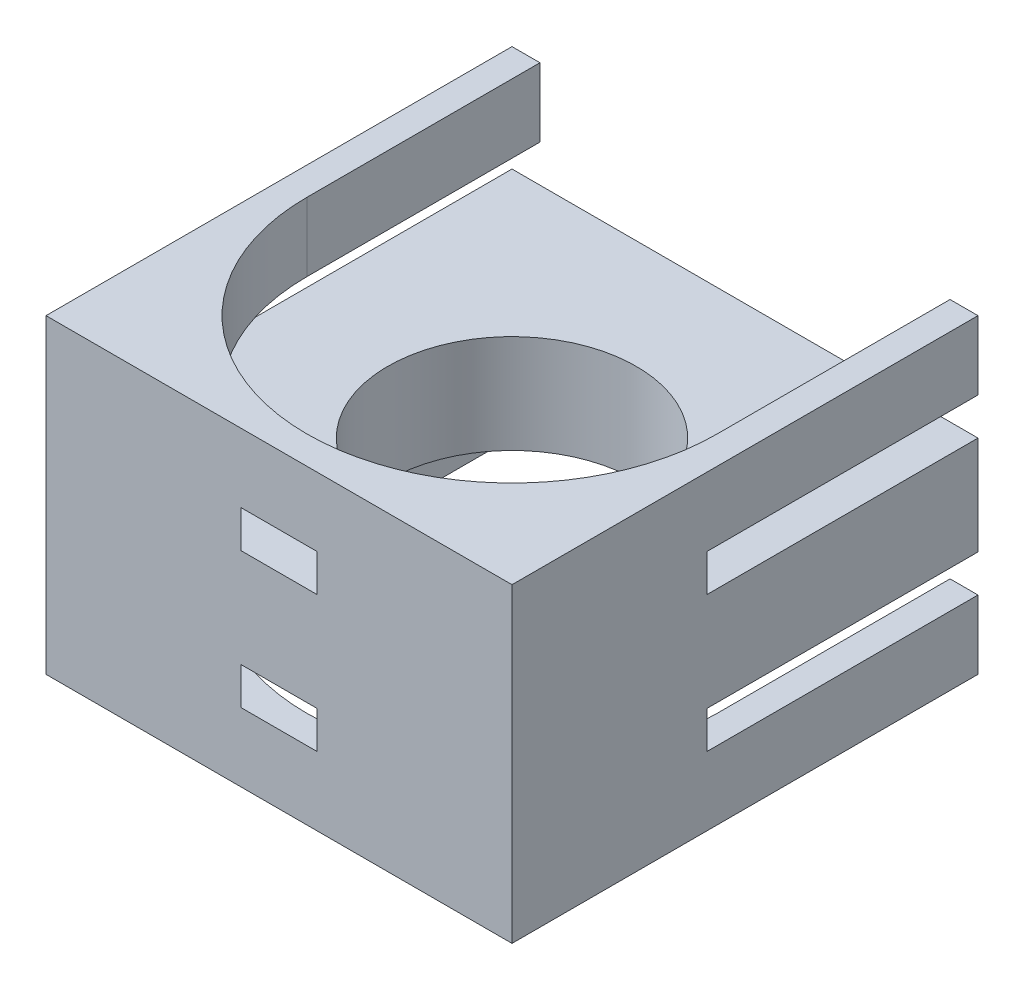
ISO-10303-21;
HEADER;
FILE_DESCRIPTION(('STEP AP214'),'2;1');
FILE_NAME('part.step','',(''),(''),'','','');
FILE_SCHEMA(('AUTOMOTIVE_DESIGN { 1 0 10303 214 1 1 1 1 }'));
ENDSEC;
DATA;
#1=APPLICATION_CONTEXT('core data for automotive mechanical design processes');
#2=APPLICATION_PROTOCOL_DEFINITION('international standard','automotive_design',2000,#1);
#3=PRODUCT_CONTEXT('',#1,'mechanical');
#4=PRODUCT('Part','Part','',(#3));
#5=PRODUCT_RELATED_PRODUCT_CATEGORY('part','',(#4));
#6=PRODUCT_DEFINITION_FORMATION('','',#4);
#7=PRODUCT_DEFINITION_CONTEXT('part definition',#1,'design');
#8=PRODUCT_DEFINITION('design','',#6,#7);
#9=PRODUCT_DEFINITION_SHAPE('','',#8);
#10=(LENGTH_UNIT() NAMED_UNIT(*) SI_UNIT(.MILLI.,.METRE.));
#11=(NAMED_UNIT(*) PLANE_ANGLE_UNIT() SI_UNIT($,.RADIAN.));
#12=(NAMED_UNIT(*) SI_UNIT($,.STERADIAN.) SOLID_ANGLE_UNIT());
#13=UNCERTAINTY_MEASURE_WITH_UNIT(LENGTH_MEASURE(1.E-05),#10,'distance_accuracy_value','');
#14=(GEOMETRIC_REPRESENTATION_CONTEXT(3) GLOBAL_UNCERTAINTY_ASSIGNED_CONTEXT((#13)) GLOBAL_UNIT_ASSIGNED_CONTEXT((#10,
#11,#12)) REPRESENTATION_CONTEXT('',''));
#15=CARTESIAN_POINT('',(0.,0.,0.));
#16=DIRECTION('',(0.,0.,1.));
#17=DIRECTION('',(1.,0.,0.));
#18=AXIS2_PLACEMENT_3D('',#15,#16,#17);
#19=CARTESIAN_POINT('',(0.,5.,15.));
#20=DIRECTION('',(1.,0.,0.));
#21=DIRECTION('',(0.,0.,-1.));
#22=AXIS2_PLACEMENT_3D('',#19,#20,#21);
#23=PLANE('',#22);
#24=DIRECTION('',(0.,0.,1.));
#25=VECTOR('',#24,1.);
#26=CARTESIAN_POINT('',(0.,0.912499999999999,15.));
#27=LINE('',#26,#25);
#28=CARTESIAN_POINT('',(0.,0.912499999999999,0.));
#29=VERTEX_POINT('',#28);
#30=CARTESIAN_POINT('',(0.,0.912499999999999,8.72882057274446));
#31=VERTEX_POINT('',#30);
#32=EDGE_CURVE('E244',#29,#31,#27,.T.);
#33=ORIENTED_EDGE('',*,*,#32,.T.);
#34=DIRECTION('',(0.,1.,0.));
#35=VECTOR('',#34,1.);
#36=CARTESIAN_POINT('',(0.,-21.7835461480711,8.72882057274446));
#37=LINE('',#36,#35);
#38=CARTESIAN_POINT('',(0.,-0.287500000000003,8.72882057274447));
#39=VERTEX_POINT('',#38);
#40=EDGE_CURVE('E390',#39,#31,#37,.T.);
#41=ORIENTED_EDGE('',*,*,#40,.F.);
#42=DIRECTION('',(0.,0.,-1.));
#43=VECTOR('',#42,1.);
#44=CARTESIAN_POINT('',(0.,-0.287500000000004,15.));
#45=LINE('',#44,#43);
#46=CARTESIAN_POINT('',(0.,-0.287500000000004,0.));
#47=VERTEX_POINT('',#46);
#48=EDGE_CURVE('E251',#39,#47,#45,.T.);
#49=ORIENTED_EDGE('',*,*,#48,.T.);
#50=DIRECTION('',(0.,-1.,0.));
#51=VECTOR('',#50,1.);
#52=CARTESIAN_POINT('',(0.,5.,0.));
#53=LINE('',#52,#51);
#54=CARTESIAN_POINT('',(0.,-2.5,0.));
#55=VERTEX_POINT('',#54);
#56=EDGE_CURVE('E258',#47,#55,#53,.T.);
#57=ORIENTED_EDGE('',*,*,#56,.T.);
#58=DIRECTION('',(0.,0.,1.));
#59=VECTOR('',#58,1.);
#60=CARTESIAN_POINT('',(0.,-2.5,-15.2069063257455));
#61=LINE('',#60,#59);
#62=CARTESIAN_POINT('',(0.,-2.5,15.));
#63=VERTEX_POINT('',#62);
#64=EDGE_CURVE('E303',#55,#63,#61,.T.);
#65=ORIENTED_EDGE('',*,*,#64,.T.);
#66=DIRECTION('',(0.,-1.,0.));
#67=VECTOR('',#66,1.);
#68=CARTESIAN_POINT('',(0.,5.,15.));
#69=LINE('',#68,#67);
#70=CARTESIAN_POINT('',(0.,7.5,15.));
#71=VERTEX_POINT('',#70);
#72=EDGE_CURVE('E272',#71,#63,#69,.T.);
#73=ORIENTED_EDGE('',*,*,#72,.F.);
#74=DIRECTION('',(0.,0.,1.));
#75=VECTOR('',#74,1.);
#76=CARTESIAN_POINT('',(0.,7.5,-15.2069063257455));
#77=LINE('',#76,#75);
#78=CARTESIAN_POINT('',(0.,7.5,0.));
#79=VERTEX_POINT('',#78);
#80=EDGE_CURVE('E314',#79,#71,#77,.T.);
#81=ORIENTED_EDGE('',*,*,#80,.F.);
#82=CARTESIAN_POINT('',(0.,5.2875,0.));
#83=VERTEX_POINT('',#82);
#84=EDGE_CURVE('E257',#79,#83,#53,.T.);
#85=ORIENTED_EDGE('',*,*,#84,.T.);
#86=DIRECTION('',(0.,0.,-1.));
#87=VECTOR('',#86,1.);
#88=CARTESIAN_POINT('',(0.,5.2875,15.));
#89=LINE('',#88,#87);
#90=CARTESIAN_POINT('',(0.,5.2875,8.72882057274447));
#91=VERTEX_POINT('',#90);
#92=EDGE_CURVE('E337',#91,#83,#89,.T.);
#93=ORIENTED_EDGE('',*,*,#92,.F.);
#94=DIRECTION('',(0.,-1.,0.));
#95=VECTOR('',#94,1.);
#96=CARTESIAN_POINT('',(0.,26.7835461480711,8.72882057274446));
#97=LINE('',#96,#95);
#98=CARTESIAN_POINT('',(0.,4.0875,8.72882057274446));
#99=VERTEX_POINT('',#98);
#100=EDGE_CURVE('E353',#99,#91,#97,.F.);
#101=ORIENTED_EDGE('',*,*,#100,.F.);
#102=DIRECTION('',(0.,0.,1.));
#103=VECTOR('',#102,1.);
#104=CARTESIAN_POINT('',(0.,4.0875,15.));
#105=LINE('',#104,#103);
#106=CARTESIAN_POINT('',(0.,4.0875,0.));
#107=VERTEX_POINT('',#106);
#108=EDGE_CURVE('E256',#107,#99,#105,.T.);
#109=ORIENTED_EDGE('',*,*,#108,.F.);
#110=EDGE_CURVE('E239',#107,#29,#53,.T.);
#111=ORIENTED_EDGE('',*,*,#110,.T.);
#112=EDGE_LOOP('',(#33,#41,#49,#57,#65,#73,#81,#85,#93,#101,#109,#111));
#113=FACE_BOUND('',#112,.T.);
#114=ADVANCED_FACE('F34',(#113),#23,.F.);
#115=CARTESIAN_POINT('',(15.,5.,15.));
#116=DIRECTION('',(-1.,0.,0.));
#117=DIRECTION('',(0.,0.,1.));
#118=AXIS2_PLACEMENT_3D('',#115,#116,#117);
#119=PLANE('',#118);
#120=DIRECTION('',(0.,1.,0.));
#121=VECTOR('',#120,1.);
#122=CARTESIAN_POINT('',(15.,-21.7835461480711,8.72882057274447));
#123=LINE('',#122,#121);
#124=CARTESIAN_POINT('',(15.,0.912499999999999,8.72882057274447));
#125=VERTEX_POINT('',#124);
#126=CARTESIAN_POINT('',(15.,-0.287500000000003,8.72882057274448));
#127=VERTEX_POINT('',#126);
#128=EDGE_CURVE('E392',#125,#127,#123,.F.);
#129=ORIENTED_EDGE('',*,*,#128,.F.);
#130=DIRECTION('',(0.,0.,-1.));
#131=VECTOR('',#130,1.);
#132=CARTESIAN_POINT('',(15.,0.912499999999999,15.));
#133=LINE('',#132,#131);
#134=CARTESIAN_POINT('',(15.,0.912499999999999,0.));
#135=VERTEX_POINT('',#134);
#136=EDGE_CURVE('E252',#125,#135,#133,.T.);
#137=ORIENTED_EDGE('',*,*,#136,.T.);
#138=DIRECTION('',(0.,-1.,0.));
#139=VECTOR('',#138,1.);
#140=CARTESIAN_POINT('',(15.,5.,0.));
#141=LINE('',#140,#139);
#142=CARTESIAN_POINT('',(15.,4.0875,0.));
#143=VERTEX_POINT('',#142);
#144=EDGE_CURVE('E241',#143,#135,#141,.T.);
#145=ORIENTED_EDGE('',*,*,#144,.F.);
#146=DIRECTION('',(0.,0.,-1.));
#147=VECTOR('',#146,1.);
#148=CARTESIAN_POINT('',(15.,4.0875,15.));
#149=LINE('',#148,#147);
#150=CARTESIAN_POINT('',(15.,4.0875,8.72882057274447));
#151=VERTEX_POINT('',#150);
#152=EDGE_CURVE('E286',#151,#143,#149,.T.);
#153=ORIENTED_EDGE('',*,*,#152,.F.);
#154=DIRECTION('',(0.,-1.,0.));
#155=VECTOR('',#154,1.);
#156=CARTESIAN_POINT('',(15.,26.7835461480711,8.72882057274447));
#157=LINE('',#156,#155);
#158=CARTESIAN_POINT('',(15.,5.2875,8.72882057274448));
#159=VERTEX_POINT('',#158);
#160=EDGE_CURVE('E356',#159,#151,#157,.T.);
#161=ORIENTED_EDGE('',*,*,#160,.F.);
#162=DIRECTION('',(0.,0.,1.));
#163=VECTOR('',#162,1.);
#164=CARTESIAN_POINT('',(15.,5.2875,15.));
#165=LINE('',#164,#163);
#166=CARTESIAN_POINT('',(15.,5.2875,0.));
#167=VERTEX_POINT('',#166);
#168=EDGE_CURVE('E331',#167,#159,#165,.T.);
#169=ORIENTED_EDGE('',*,*,#168,.F.);
#170=CARTESIAN_POINT('',(15.,7.5,0.));
#171=VERTEX_POINT('',#170);
#172=EDGE_CURVE('E267',#171,#167,#141,.T.);
#173=ORIENTED_EDGE('',*,*,#172,.F.);
#174=DIRECTION('',(0.,0.,1.));
#175=VECTOR('',#174,1.);
#176=CARTESIAN_POINT('',(15.,7.5,-15.2069063257455));
#177=LINE('',#176,#175);
#178=CARTESIAN_POINT('',(15.,7.5,15.));
#179=VERTEX_POINT('',#178);
#180=EDGE_CURVE('E265',#171,#179,#177,.T.);
#181=ORIENTED_EDGE('',*,*,#180,.T.);
#182=DIRECTION('',(0.,-1.,0.));
#183=VECTOR('',#182,1.);
#184=CARTESIAN_POINT('',(15.,5.,15.));
#185=LINE('',#184,#183);
#186=CARTESIAN_POINT('',(15.,-2.5,15.));
#187=VERTEX_POINT('',#186);
#188=EDGE_CURVE('E270',#179,#187,#185,.T.);
#189=ORIENTED_EDGE('',*,*,#188,.T.);
#190=DIRECTION('',(0.,0.,1.));
#191=VECTOR('',#190,1.);
#192=CARTESIAN_POINT('',(15.,-2.5,-15.2069063257455));
#193=LINE('',#192,#191);
#194=CARTESIAN_POINT('',(15.,-2.5,0.));
#195=VERTEX_POINT('',#194);
#196=EDGE_CURVE('E298',#195,#187,#193,.T.);
#197=ORIENTED_EDGE('',*,*,#196,.F.);
#198=CARTESIAN_POINT('',(15.,-0.287500000000004,0.));
#199=VERTEX_POINT('',#198);
#200=EDGE_CURVE('E261',#199,#195,#141,.T.);
#201=ORIENTED_EDGE('',*,*,#200,.F.);
#202=DIRECTION('',(0.,0.,1.));
#203=VECTOR('',#202,1.);
#204=CARTESIAN_POINT('',(15.,-0.287500000000004,15.));
#205=LINE('',#204,#203);
#206=EDGE_CURVE('E379',#199,#127,#205,.T.);
#207=ORIENTED_EDGE('',*,*,#206,.T.);
#208=EDGE_LOOP('',(#129,#137,#145,#153,#161,#169,#173,#181,#189,#197,#201,#207));
#209=FACE_BOUND('',#208,.T.);
#210=ADVANCED_FACE('F289',(#209),#119,.F.);
#211=CARTESIAN_POINT('',(15.,5.,15.));
#212=DIRECTION('',(0.,0.,-1.));
#213=DIRECTION('',(-1.,0.,0.));
#214=AXIS2_PLACEMENT_3D('',#211,#212,#213);
#215=PLANE('',#214);
#216=DIRECTION('',(1.,0.,0.));
#217=VECTOR('',#216,1.);
#218=CARTESIAN_POINT('',(15.,4.0875,15.));
#219=LINE('',#218,#217);
#220=CARTESIAN_POINT('',(6.27117942725554,4.0875,15.));
#221=VERTEX_POINT('',#220);
#222=CARTESIAN_POINT('',(8.72882057274447,4.0875,15.));
#223=VERTEX_POINT('',#222);
#224=EDGE_CURVE('E362',#221,#223,#219,.T.);
#225=ORIENTED_EDGE('',*,*,#224,.F.);
#226=DIRECTION('',(0.,-1.,0.));
#227=VECTOR('',#226,1.);
#228=CARTESIAN_POINT('',(6.27117942725554,26.7835461480711,15.));
#229=LINE('',#228,#227);
#230=CARTESIAN_POINT('',(6.27117942725553,5.2875,15.));
#231=VERTEX_POINT('',#230);
#232=EDGE_CURVE('E360',#231,#221,#229,.T.);
#233=ORIENTED_EDGE('',*,*,#232,.F.);
#234=DIRECTION('',(-1.,0.,0.));
#235=VECTOR('',#234,1.);
#236=CARTESIAN_POINT('',(15.,5.2875,15.));
#237=LINE('',#236,#235);
#238=CARTESIAN_POINT('',(8.72882057274447,5.2875,15.));
#239=VERTEX_POINT('',#238);
#240=EDGE_CURVE('E364',#239,#231,#237,.T.);
#241=ORIENTED_EDGE('',*,*,#240,.F.);
#242=DIRECTION('',(0.,-1.,0.));
#243=VECTOR('',#242,1.);
#244=CARTESIAN_POINT('',(8.72882057274447,26.7835461480711,15.));
#245=LINE('',#244,#243);
#246=EDGE_CURVE('E358',#223,#239,#245,.F.);
#247=ORIENTED_EDGE('',*,*,#246,.F.);
#248=EDGE_LOOP('',(#225,#233,#241,#247));
#249=FACE_BOUND('',#248,.T.);
#250=ORIENTED_EDGE('',*,*,#72,.T.);
#251=DIRECTION('',(1.,0.,0.));
#252=VECTOR('',#251,1.);
#253=CARTESIAN_POINT('',(15.,-2.5,15.));
#254=LINE('',#253,#252);
#255=EDGE_CURVE('E329',#63,#187,#254,.T.);
#256=ORIENTED_EDGE('',*,*,#255,.T.);
#257=ORIENTED_EDGE('',*,*,#188,.F.);
#258=DIRECTION('',(-1.,0.,0.));
#259=VECTOR('',#258,1.);
#260=CARTESIAN_POINT('',(0.,7.5,15.));
#261=LINE('',#260,#259);
#262=EDGE_CURVE('E305',#179,#71,#261,.T.);
#263=ORIENTED_EDGE('',*,*,#262,.T.);
#264=EDGE_LOOP('',(#250,#256,#257,#263));
#265=FACE_BOUND('',#264,.T.);
#266=DIRECTION('',(-1.,0.,0.));
#267=VECTOR('',#266,1.);
#268=CARTESIAN_POINT('',(15.,0.912499999999999,15.));
#269=LINE('',#268,#267);
#270=CARTESIAN_POINT('',(8.72882057274447,0.912499999999999,15.));
#271=VERTEX_POINT('',#270);
#272=CARTESIAN_POINT('',(6.27117942725554,0.912499999999999,15.));
#273=VERTEX_POINT('',#272);
#274=EDGE_CURVE('E399',#271,#273,#269,.T.);
#275=ORIENTED_EDGE('',*,*,#274,.F.);
#276=DIRECTION('',(0.,1.,0.));
#277=VECTOR('',#276,1.);
#278=CARTESIAN_POINT('',(8.72882057274447,-21.7835461480711,15.));
#279=LINE('',#278,#277);
#280=CARTESIAN_POINT('',(8.72882057274447,-0.287500000000003,15.));
#281=VERTEX_POINT('',#280);
#282=EDGE_CURVE('E397',#281,#271,#279,.T.);
#283=ORIENTED_EDGE('',*,*,#282,.F.);
#284=DIRECTION('',(-1.,0.,0.));
#285=VECTOR('',#284,1.);
#286=CARTESIAN_POINT('',(15.,-0.287500000000004,15.));
#287=LINE('',#286,#285);
#288=CARTESIAN_POINT('',(6.27117942725553,-0.287500000000003,15.));
#289=VERTEX_POINT('',#288);
#290=EDGE_CURVE('E401',#281,#289,#287,.T.);
#291=ORIENTED_EDGE('',*,*,#290,.T.);
#292=DIRECTION('',(0.,1.,0.));
#293=VECTOR('',#292,1.);
#294=CARTESIAN_POINT('',(6.27117942725554,-21.7835461480711,15.));
#295=LINE('',#294,#293);
#296=EDGE_CURVE('E395',#273,#289,#295,.F.);
#297=ORIENTED_EDGE('',*,*,#296,.F.);
#298=EDGE_LOOP('',(#275,#283,#291,#297));
#299=FACE_BOUND('',#298,.T.);
#300=ADVANCED_FACE('F326',(#249,#265,#299),#215,.F.);
#301=CARTESIAN_POINT('',(15.,5.,0.));
#302=DIRECTION('',(0.,0.,1.));
#303=DIRECTION('',(1.,0.,0.));
#304=AXIS2_PLACEMENT_3D('',#301,#302,#303);
#305=PLANE('',#304);
#306=DIRECTION('',(1.,0.,0.));
#307=VECTOR('',#306,1.);
#308=CARTESIAN_POINT('',(15.,-0.287500000000004,0.));
#309=LINE('',#308,#307);
#310=CARTESIAN_POINT('',(0.899999999999998,-0.287500000000004,0.));
#311=VERTEX_POINT('',#310);
#312=EDGE_CURVE('E11',#47,#311,#309,.T.);
#313=ORIENTED_EDGE('',*,*,#312,.T.);
#314=DIRECTION('',(0.,-1.,0.));
#315=VECTOR('',#314,1.);
#316=CARTESIAN_POINT('',(0.899999999999998,5.,0.));
#317=LINE('',#316,#315);
#318=CARTESIAN_POINT('',(0.899999999999998,-2.5,0.));
#319=VERTEX_POINT('',#318);
#320=EDGE_CURVE('E381',#311,#319,#317,.T.);
#321=ORIENTED_EDGE('',*,*,#320,.T.);
#322=DIRECTION('',(-1.,0.,0.));
#323=VECTOR('',#322,1.);
#324=CARTESIAN_POINT('',(15.,-2.5,0.));
#325=LINE('',#324,#323);
#326=EDGE_CURVE('E302',#319,#55,#325,.T.);
#327=ORIENTED_EDGE('',*,*,#326,.T.);
#328=ORIENTED_EDGE('',*,*,#56,.F.);
#329=EDGE_LOOP('',(#313,#321,#327,#328));
#330=FACE_BOUND('',#329,.T.);
#331=ADVANCED_FACE('F433',(#330),#305,.F.);
#332=ORIENTED_EDGE('',*,*,#144,.T.);
#333=DIRECTION('',(-1.,0.,0.));
#334=VECTOR('',#333,1.);
#335=CARTESIAN_POINT('',(15.,0.912499999999999,0.));
#336=LINE('',#335,#334);
#337=EDGE_CURVE('E42',#135,#29,#336,.T.);
#338=ORIENTED_EDGE('',*,*,#337,.T.);
#339=ORIENTED_EDGE('',*,*,#110,.F.);
#340=DIRECTION('',(-1.,0.,0.));
#341=VECTOR('',#340,1.);
#342=CARTESIAN_POINT('',(15.,4.0875,0.));
#343=LINE('',#342,#341);
#344=EDGE_CURVE('E225',#143,#107,#343,.T.);
#345=ORIENTED_EDGE('',*,*,#344,.F.);
#346=EDGE_LOOP('',(#332,#338,#339,#345));
#347=FACE_BOUND('',#346,.T.);
#348=ADVANCED_FACE('F236',(#347),#305,.F.);
#349=DIRECTION('',(0.,-1.,0.));
#350=VECTOR('',#349,1.);
#351=CARTESIAN_POINT('',(14.1,5.,0.));
#352=LINE('',#351,#350);
#353=CARTESIAN_POINT('',(14.1,7.5,0.));
#354=VERTEX_POINT('',#353);
#355=CARTESIAN_POINT('',(14.1,5.2875,0.));
#356=VERTEX_POINT('',#355);
#357=EDGE_CURVE('E339',#354,#356,#352,.T.);
#358=ORIENTED_EDGE('',*,*,#357,.F.);
#359=DIRECTION('',(1.,0.,0.));
#360=VECTOR('',#359,1.);
#361=CARTESIAN_POINT('',(0.,7.5,0.));
#362=LINE('',#361,#360);
#363=EDGE_CURVE('E313',#354,#171,#362,.T.);
#364=ORIENTED_EDGE('',*,*,#363,.T.);
#365=ORIENTED_EDGE('',*,*,#172,.T.);
#366=DIRECTION('',(1.,0.,0.));
#367=VECTOR('',#366,1.);
#368=CARTESIAN_POINT('',(15.,5.2875,0.));
#369=LINE('',#368,#367);
#370=EDGE_CURVE('E221',#356,#167,#369,.T.);
#371=ORIENTED_EDGE('',*,*,#370,.F.);
#372=EDGE_LOOP('',(#358,#364,#365,#371));
#373=FACE_BOUND('',#372,.T.);
#374=ADVANCED_FACE('F436',(#373),#305,.F.);
#375=DIRECTION('',(0.,1.,0.));
#376=VECTOR('',#375,1.);
#377=CARTESIAN_POINT('',(14.1,5.,0.));
#378=LINE('',#377,#376);
#379=CARTESIAN_POINT('',(14.1,-2.5,0.));
#380=VERTEX_POINT('',#379);
#381=CARTESIAN_POINT('',(14.1,-0.2875,0.));
#382=VERTEX_POINT('',#381);
#383=EDGE_CURVE('E220',#380,#382,#378,.T.);
#384=ORIENTED_EDGE('',*,*,#383,.T.);
#385=DIRECTION('',(1.,0.,0.));
#386=VECTOR('',#385,1.);
#387=CARTESIAN_POINT('',(15.,-0.287500000000004,0.));
#388=LINE('',#387,#386);
#389=EDGE_CURVE('E223',#382,#199,#388,.T.);
#390=ORIENTED_EDGE('',*,*,#389,.T.);
#391=ORIENTED_EDGE('',*,*,#200,.T.);
#392=EDGE_CURVE('E296',#195,#380,#325,.T.);
#393=ORIENTED_EDGE('',*,*,#392,.T.);
#394=EDGE_LOOP('',(#384,#390,#391,#393));
#395=FACE_BOUND('',#394,.T.);
#396=ADVANCED_FACE('F295',(#395),#305,.F.);
#397=DIRECTION('',(1.,0.,0.));
#398=VECTOR('',#397,1.);
#399=CARTESIAN_POINT('',(15.,5.2875,0.));
#400=LINE('',#399,#398);
#401=CARTESIAN_POINT('',(0.899999999999998,5.2875,0.));
#402=VERTEX_POINT('',#401);
#403=EDGE_CURVE('E280',#83,#402,#400,.T.);
#404=ORIENTED_EDGE('',*,*,#403,.F.);
#405=ORIENTED_EDGE('',*,*,#84,.F.);
#406=CARTESIAN_POINT('',(0.899999999999998,7.5,0.));
#407=VERTEX_POINT('',#406);
#408=EDGE_CURVE('E262',#79,#407,#362,.T.);
#409=ORIENTED_EDGE('',*,*,#408,.T.);
#410=DIRECTION('',(0.,1.,0.));
#411=VECTOR('',#410,1.);
#412=CARTESIAN_POINT('',(0.899999999999998,5.,0.));
#413=LINE('',#412,#411);
#414=EDGE_CURVE('E341',#402,#407,#413,.T.);
#415=ORIENTED_EDGE('',*,*,#414,.F.);
#416=EDGE_LOOP('',(#404,#405,#409,#415));
#417=FACE_BOUND('',#416,.T.);
#418=ADVANCED_FACE('F440',(#417),#305,.F.);
#419=CARTESIAN_POINT('',(0.,7.5,-15.2069063257455));
#420=DIRECTION('',(0.,1.,0.));
#421=DIRECTION('',(0.,0.,1.));
#422=AXIS2_PLACEMENT_3D('',#419,#420,#421);
#423=PLANE('',#422);
#424=DIRECTION('',(0.,0.,1.));
#425=VECTOR('',#424,1.);
#426=CARTESIAN_POINT('',(14.1,7.5,-15.2069063257455));
#427=LINE('',#426,#425);
#428=CARTESIAN_POINT('',(14.1,7.5,7.5));
#429=VERTEX_POINT('',#428);
#430=EDGE_CURVE('E277',#354,#429,#427,.T.);
#431=ORIENTED_EDGE('',*,*,#430,.T.);
#432=CARTESIAN_POINT('',(7.5,7.5,7.5));
#433=DIRECTION('',(0.,1.,0.));
#434=DIRECTION('',(0.,0.,1.));
#435=AXIS2_PLACEMENT_3D('',#432,#433,#434);
#436=CIRCLE('',#435,6.6);
#437=CARTESIAN_POINT('',(0.899999999999998,7.5,7.5));
#438=VERTEX_POINT('',#437);
#439=EDGE_CURVE('E375',#438,#429,#436,.T.);
#440=ORIENTED_EDGE('',*,*,#439,.F.);
#441=DIRECTION('',(0.,0.,-1.));
#442=VECTOR('',#441,1.);
#443=CARTESIAN_POINT('',(0.899999999999998,7.5,-15.2069063257455));
#444=LINE('',#443,#442);
#445=EDGE_CURVE('E274',#438,#407,#444,.T.);
#446=ORIENTED_EDGE('',*,*,#445,.T.);
#447=ORIENTED_EDGE('',*,*,#408,.F.);
#448=ORIENTED_EDGE('',*,*,#80,.T.);
#449=ORIENTED_EDGE('',*,*,#262,.F.);
#450=ORIENTED_EDGE('',*,*,#180,.F.);
#451=ORIENTED_EDGE('',*,*,#363,.F.);
#452=EDGE_LOOP('',(#431,#440,#446,#447,#448,#449,#450,#451));
#453=FACE_BOUND('',#452,.T.);
#454=ADVANCED_FACE('F324',(#453),#423,.T.);
#455=CARTESIAN_POINT('',(15.,-2.5,-15.2069063257455));
#456=DIRECTION('',(0.,-1.,0.));
#457=DIRECTION('',(0.,0.,-1.));
#458=AXIS2_PLACEMENT_3D('',#455,#456,#457);
#459=PLANE('',#458);
#460=DIRECTION('',(0.,0.,-1.));
#461=VECTOR('',#460,1.);
#462=CARTESIAN_POINT('',(0.899999999999998,-2.5,-15.2069063257455));
#463=LINE('',#462,#461);
#464=CARTESIAN_POINT('',(0.899999999999999,-2.5,7.5));
#465=VERTEX_POINT('',#464);
#466=EDGE_CURVE('E216',#465,#319,#463,.T.);
#467=ORIENTED_EDGE('',*,*,#466,.F.);
#468=CARTESIAN_POINT('',(7.5,-2.5,7.5));
#469=DIRECTION('',(0.,-1.,0.));
#470=DIRECTION('',(0.,0.,-1.));
#471=AXIS2_PLACEMENT_3D('',#468,#469,#470);
#472=CIRCLE('',#471,6.6);
#473=CARTESIAN_POINT('',(14.1,-2.5,7.5));
#474=VERTEX_POINT('',#473);
#475=EDGE_CURVE('E197',#474,#465,#472,.T.);
#476=ORIENTED_EDGE('',*,*,#475,.F.);
#477=DIRECTION('',(0.,0.,1.));
#478=VECTOR('',#477,1.);
#479=CARTESIAN_POINT('',(14.1,-2.5,-15.2069063257455));
#480=LINE('',#479,#478);
#481=EDGE_CURVE('E213',#380,#474,#480,.T.);
#482=ORIENTED_EDGE('',*,*,#481,.F.);
#483=ORIENTED_EDGE('',*,*,#392,.F.);
#484=ORIENTED_EDGE('',*,*,#196,.T.);
#485=ORIENTED_EDGE('',*,*,#255,.F.);
#486=ORIENTED_EDGE('',*,*,#64,.F.);
#487=ORIENTED_EDGE('',*,*,#326,.F.);
#488=EDGE_LOOP('',(#467,#476,#482,#483,#484,#485,#486,#487));
#489=FACE_BOUND('',#488,.T.);
#490=ADVANCED_FACE('F211',(#489),#459,.T.);
#491=CARTESIAN_POINT('',(14.1,5.2875,-1.2E-05));
#492=DIRECTION('',(0.,-1.,0.));
#493=DIRECTION('',(1.,0.,0.));
#494=AXIS2_PLACEMENT_3D('',#491,#492,#493);
#495=PLANE('',#494);
#496=DIRECTION('',(0.,0.,1.));
#497=VECTOR('',#496,1.);
#498=CARTESIAN_POINT('',(0.899999999999998,5.2875,-1.2E-05));
#499=LINE('',#498,#497);
#500=CARTESIAN_POINT('',(0.899999999999998,5.2875,7.5));
#501=VERTEX_POINT('',#500);
#502=EDGE_CURVE('E346',#402,#501,#499,.T.);
#503=ORIENTED_EDGE('',*,*,#502,.T.);
#504=CARTESIAN_POINT('',(7.5,5.28749999999998,7.5));
#505=DIRECTION('',(0.,-1.,0.));
#506=DIRECTION('',(1.,0.,0.));
#507=AXIS2_PLACEMENT_3D('',#504,#505,#506);
#508=CIRCLE('',#507,6.6);
#509=CARTESIAN_POINT('',(14.1,5.2875,7.5));
#510=VERTEX_POINT('',#509);
#511=EDGE_CURVE('E372',#501,#510,#508,.F.);
#512=ORIENTED_EDGE('',*,*,#511,.T.);
#513=DIRECTION('',(0.,0.,1.));
#514=VECTOR('',#513,1.);
#515=CARTESIAN_POINT('',(14.1,5.2875,-1.2E-05));
#516=LINE('',#515,#514);
#517=EDGE_CURVE('E343',#356,#510,#516,.T.);
#518=ORIENTED_EDGE('',*,*,#517,.F.);
#519=ORIENTED_EDGE('',*,*,#370,.T.);
#520=ORIENTED_EDGE('',*,*,#168,.T.);
#521=CARTESIAN_POINT('',(7.5,5.2875,7.5));
#522=DIRECTION('',(0.,-1.,0.));
#523=DIRECTION('',(0.,0.,-1.));
#524=AXIS2_PLACEMENT_3D('',#521,#522,#523);
#525=CIRCLE('',#524,7.6);
#526=EDGE_CURVE('E57',#159,#239,#525,.T.);
#527=ORIENTED_EDGE('',*,*,#526,.T.);
#528=ORIENTED_EDGE('',*,*,#240,.T.);
#529=EDGE_CURVE('E366',#231,#91,#525,.T.);
#530=ORIENTED_EDGE('',*,*,#529,.T.);
#531=ORIENTED_EDGE('',*,*,#92,.T.);
#532=ORIENTED_EDGE('',*,*,#403,.T.);
#533=EDGE_LOOP('',(#503,#512,#518,#519,#520,#527,#528,#530,#531,#532));
#534=FACE_BOUND('',#533,.T.);
#535=ADVANCED_FACE('F445',(#534),#495,.T.);
#536=CARTESIAN_POINT('',(7.5,4.0875,-1.2E-05));
#537=DIRECTION('',(0.,1.,0.));
#538=DIRECTION('',(0.,0.,1.));
#539=AXIS2_PLACEMENT_3D('',#536,#537,#538);
#540=PLANE('',#539);
#541=CARTESIAN_POINT('',(7.5,4.0875,7.5));
#542=DIRECTION('',(0.,1.,0.));
#543=DIRECTION('',(0.,0.,1.));
#544=AXIS2_PLACEMENT_3D('',#541,#542,#543);
#545=CIRCLE('',#544,4.);
#546=CARTESIAN_POINT('',(7.5,4.0875,11.5));
#547=VERTEX_POINT('',#546);
#548=EDGE_CURVE('E409',#547,#547,#545,.T.);
#549=ORIENTED_EDGE('',*,*,#548,.F.);
#550=EDGE_LOOP('',(#549));
#551=FACE_BOUND('',#550,.T.);
#552=ORIENTED_EDGE('',*,*,#344,.T.);
#553=ORIENTED_EDGE('',*,*,#108,.T.);
#554=CARTESIAN_POINT('',(7.5,4.0875,7.5));
#555=DIRECTION('',(0.,1.,0.));
#556=DIRECTION('',(0.,0.,1.));
#557=AXIS2_PLACEMENT_3D('',#554,#555,#556);
#558=CIRCLE('',#557,7.6);
#559=EDGE_CURVE('E371',#99,#221,#558,.T.);
#560=ORIENTED_EDGE('',*,*,#559,.T.);
#561=ORIENTED_EDGE('',*,*,#224,.T.);
#562=EDGE_CURVE('E369',#223,#151,#558,.T.);
#563=ORIENTED_EDGE('',*,*,#562,.T.);
#564=ORIENTED_EDGE('',*,*,#152,.T.);
#565=EDGE_LOOP('',(#552,#553,#560,#561,#563,#564));
#566=FACE_BOUND('',#565,.T.);
#567=ADVANCED_FACE('F282',(#551,#566),#540,.T.);
#568=CARTESIAN_POINT('',(14.1,7.5,-1.2E-05));
#569=DIRECTION('',(-1.,0.,0.));
#570=DIRECTION('',(0.,0.,1.));
#571=AXIS2_PLACEMENT_3D('',#568,#569,#570);
#572=PLANE('',#571);
#573=ORIENTED_EDGE('',*,*,#357,.T.);
#574=ORIENTED_EDGE('',*,*,#517,.T.);
#575=DIRECTION('',(0.,-1.,0.));
#576=VECTOR('',#575,1.);
#577=CARTESIAN_POINT('',(14.1,7.5,7.5));
#578=LINE('',#577,#576);
#579=EDGE_CURVE('E351',#429,#510,#578,.T.);
#580=ORIENTED_EDGE('',*,*,#579,.F.);
#581=ORIENTED_EDGE('',*,*,#430,.F.);
#582=EDGE_LOOP('',(#573,#574,#580,#581));
#583=FACE_BOUND('',#582,.T.);
#584=ADVANCED_FACE('F446',(#583),#572,.T.);
#585=CARTESIAN_POINT('',(0.899999999999998,5.2875,-1.2E-05));
#586=DIRECTION('',(1.,0.,0.));
#587=DIRECTION('',(0.,0.,-1.));
#588=AXIS2_PLACEMENT_3D('',#585,#586,#587);
#589=PLANE('',#588);
#590=ORIENTED_EDGE('',*,*,#414,.T.);
#591=ORIENTED_EDGE('',*,*,#445,.F.);
#592=DIRECTION('',(0.,1.,0.));
#593=VECTOR('',#592,1.);
#594=CARTESIAN_POINT('',(0.899999999999998,5.2875,7.5));
#595=LINE('',#594,#593);
#596=EDGE_CURVE('E349',#501,#438,#595,.T.);
#597=ORIENTED_EDGE('',*,*,#596,.F.);
#598=ORIENTED_EDGE('',*,*,#502,.F.);
#599=EDGE_LOOP('',(#590,#591,#597,#598));
#600=FACE_BOUND('',#599,.T.);
#601=ADVANCED_FACE('F449',(#600),#589,.T.);
#602=CARTESIAN_POINT('',(7.5,26.7835461480711,7.5));
#603=DIRECTION('',(0.,-1.,0.));
#604=DIRECTION('',(0.,0.,-1.));
#605=AXIS2_PLACEMENT_3D('',#602,#603,#604);
#606=CYLINDRICAL_SURFACE('',#605,7.6);
#607=ORIENTED_EDGE('',*,*,#100,.T.);
#608=ORIENTED_EDGE('',*,*,#529,.F.);
#609=ORIENTED_EDGE('',*,*,#232,.T.);
#610=ORIENTED_EDGE('',*,*,#559,.F.);
#611=EDGE_LOOP('',(#607,#608,#609,#610));
#612=FACE_BOUND('',#611,.T.);
#613=ADVANCED_FACE('F458',(#612),#606,.F.);
#614=ORIENTED_EDGE('',*,*,#160,.T.);
#615=ORIENTED_EDGE('',*,*,#562,.F.);
#616=ORIENTED_EDGE('',*,*,#246,.T.);
#617=ORIENTED_EDGE('',*,*,#526,.F.);
#618=EDGE_LOOP('',(#614,#615,#616,#617));
#619=FACE_BOUND('',#618,.T.);
#620=ADVANCED_FACE('F462',(#619),#606,.F.);
#621=CARTESIAN_POINT('',(7.5,7.5,7.5));
#622=DIRECTION('',(0.,-1.,0.));
#623=DIRECTION('',(0.,0.,-1.));
#624=AXIS2_PLACEMENT_3D('',#621,#622,#623);
#625=CYLINDRICAL_SURFACE('',#624,6.6);
#626=ORIENTED_EDGE('',*,*,#511,.F.);
#627=ORIENTED_EDGE('',*,*,#596,.T.);
#628=ORIENTED_EDGE('',*,*,#439,.T.);
#629=ORIENTED_EDGE('',*,*,#579,.T.);
#630=EDGE_LOOP('',(#626,#627,#628,#629));
#631=FACE_BOUND('',#630,.T.);
#632=ADVANCED_FACE('F464',(#631),#625,.F.);
#633=CARTESIAN_POINT('',(-0.100000000000001,-0.287500000000004,-1.2E-05));
#634=DIRECTION('',(0.,-1.,0.));
#635=DIRECTION('',(0.,0.,-1.));
#636=AXIS2_PLACEMENT_3D('',#633,#634,#635);
#637=PLANE('',#636);
#638=CARTESIAN_POINT('',(7.5,-0.287500000000004,7.5));
#639=DIRECTION('',(0.,-1.,0.));
#640=DIRECTION('',(0.,0.,-1.));
#641=AXIS2_PLACEMENT_3D('',#638,#639,#640);
#642=CIRCLE('',#641,6.6);
#643=CARTESIAN_POINT('',(0.900000000000001,-0.287500000000004,7.5));
#644=VERTEX_POINT('',#643);
#645=CARTESIAN_POINT('',(14.1,-0.287500000000004,7.5));
#646=VERTEX_POINT('',#645);
#647=EDGE_CURVE('E200',#644,#646,#642,.F.);
#648=ORIENTED_EDGE('',*,*,#647,.F.);
#649=DIRECTION('',(0.,0.,1.));
#650=VECTOR('',#649,1.);
#651=CARTESIAN_POINT('',(0.899999999999998,-0.287500000000004,-1.2E-05));
#652=LINE('',#651,#650);
#653=EDGE_CURVE('E385',#311,#644,#652,.T.);
#654=ORIENTED_EDGE('',*,*,#653,.F.);
#655=ORIENTED_EDGE('',*,*,#312,.F.);
#656=ORIENTED_EDGE('',*,*,#48,.F.);
#657=CARTESIAN_POINT('',(7.5,-0.287500000000003,7.5));
#658=DIRECTION('',(0.,-1.,0.));
#659=DIRECTION('',(0.,0.,-1.));
#660=AXIS2_PLACEMENT_3D('',#657,#658,#659);
#661=CIRCLE('',#660,7.6);
#662=EDGE_CURVE('E49',#289,#39,#661,.T.);
#663=ORIENTED_EDGE('',*,*,#662,.F.);
#664=ORIENTED_EDGE('',*,*,#290,.F.);
#665=EDGE_CURVE('E404',#127,#281,#661,.T.);
#666=ORIENTED_EDGE('',*,*,#665,.F.);
#667=ORIENTED_EDGE('',*,*,#206,.F.);
#668=ORIENTED_EDGE('',*,*,#389,.F.);
#669=DIRECTION('',(0.,0.,1.));
#670=VECTOR('',#669,1.);
#671=CARTESIAN_POINT('',(14.1,-0.2875,-1.2E-05));
#672=LINE('',#671,#670);
#673=EDGE_CURVE('E205',#382,#646,#672,.T.);
#674=ORIENTED_EDGE('',*,*,#673,.T.);
#675=EDGE_LOOP('',(#648,#654,#655,#656,#663,#664,#666,#667,#668,#674));
#676=FACE_BOUND('',#675,.T.);
#677=ADVANCED_FACE('F467',(#676),#637,.F.);
#678=CARTESIAN_POINT('',(15.1,0.912499999999999,-1.2E-05));
#679=DIRECTION('',(0.,1.,0.));
#680=DIRECTION('',(0.,0.,1.));
#681=AXIS2_PLACEMENT_3D('',#678,#679,#680);
#682=PLANE('',#681);
#683=CARTESIAN_POINT('',(7.5,0.912499999999999,7.5));
#684=DIRECTION('',(0.,1.,0.));
#685=DIRECTION('',(0.,0.,1.));
#686=AXIS2_PLACEMENT_3D('',#683,#684,#685);
#687=CIRCLE('',#686,4.);
#688=CARTESIAN_POINT('',(7.5,0.912499999999999,11.5));
#689=VERTEX_POINT('',#688);
#690=EDGE_CURVE('E37',#689,#689,#687,.T.);
#691=ORIENTED_EDGE('',*,*,#690,.T.);
#692=EDGE_LOOP('',(#691));
#693=FACE_BOUND('',#692,.T.);
#694=ORIENTED_EDGE('',*,*,#337,.F.);
#695=ORIENTED_EDGE('',*,*,#136,.F.);
#696=CARTESIAN_POINT('',(7.5,0.912499999999999,7.5));
#697=DIRECTION('',(0.,-1.,0.));
#698=DIRECTION('',(0.,0.,-1.));
#699=AXIS2_PLACEMENT_3D('',#696,#697,#698);
#700=CIRCLE('',#699,7.6);
#701=EDGE_CURVE('E406',#125,#271,#700,.T.);
#702=ORIENTED_EDGE('',*,*,#701,.T.);
#703=ORIENTED_EDGE('',*,*,#274,.T.);
#704=EDGE_CURVE('E247',#273,#31,#700,.T.);
#705=ORIENTED_EDGE('',*,*,#704,.T.);
#706=ORIENTED_EDGE('',*,*,#32,.F.);
#707=EDGE_LOOP('',(#694,#695,#702,#703,#705,#706));
#708=FACE_BOUND('',#707,.T.);
#709=ADVANCED_FACE('F245',(#693,#708),#682,.F.);
#710=CARTESIAN_POINT('',(0.899999999999998,-0.287500000000004,-1.2E-05));
#711=DIRECTION('',(-1.,0.,0.));
#712=DIRECTION('',(0.,0.,1.));
#713=AXIS2_PLACEMENT_3D('',#710,#711,#712);
#714=PLANE('',#713);
#715=ORIENTED_EDGE('',*,*,#653,.T.);
#716=DIRECTION('',(0.,-1.,0.));
#717=VECTOR('',#716,1.);
#718=CARTESIAN_POINT('',(0.899999999999998,-0.287500000000004,7.5));
#719=LINE('',#718,#717);
#720=EDGE_CURVE('E206',#644,#465,#719,.T.);
#721=ORIENTED_EDGE('',*,*,#720,.T.);
#722=ORIENTED_EDGE('',*,*,#466,.T.);
#723=ORIENTED_EDGE('',*,*,#320,.F.);
#724=EDGE_LOOP('',(#715,#721,#722,#723));
#725=FACE_BOUND('',#724,.T.);
#726=ADVANCED_FACE('F469',(#725),#714,.F.);
#727=CARTESIAN_POINT('',(14.1,-2.5,-1.2E-05));
#728=DIRECTION('',(1.,0.,0.));
#729=DIRECTION('',(0.,0.,-1.));
#730=AXIS2_PLACEMENT_3D('',#727,#728,#729);
#731=PLANE('',#730);
#732=ORIENTED_EDGE('',*,*,#481,.T.);
#733=DIRECTION('',(0.,1.,0.));
#734=VECTOR('',#733,1.);
#735=CARTESIAN_POINT('',(14.1,-2.5,7.5));
#736=LINE('',#735,#734);
#737=EDGE_CURVE('E194',#474,#646,#736,.T.);
#738=ORIENTED_EDGE('',*,*,#737,.T.);
#739=ORIENTED_EDGE('',*,*,#673,.F.);
#740=ORIENTED_EDGE('',*,*,#383,.F.);
#741=EDGE_LOOP('',(#732,#738,#739,#740));
#742=FACE_BOUND('',#741,.T.);
#743=ADVANCED_FACE('F218',(#742),#731,.F.);
#744=CARTESIAN_POINT('',(7.5,-21.7835461480711,7.5));
#745=DIRECTION('',(0.,1.,0.));
#746=DIRECTION('',(0.,0.,1.));
#747=AXIS2_PLACEMENT_3D('',#744,#745,#746);
#748=CYLINDRICAL_SURFACE('',#747,7.6);
#749=ORIENTED_EDGE('',*,*,#40,.T.);
#750=ORIENTED_EDGE('',*,*,#704,.F.);
#751=ORIENTED_EDGE('',*,*,#296,.T.);
#752=ORIENTED_EDGE('',*,*,#662,.T.);
#753=EDGE_LOOP('',(#749,#750,#751,#752));
#754=FACE_BOUND('',#753,.T.);
#755=ADVANCED_FACE('F479',(#754),#748,.F.);
#756=ORIENTED_EDGE('',*,*,#128,.T.);
#757=ORIENTED_EDGE('',*,*,#665,.T.);
#758=ORIENTED_EDGE('',*,*,#282,.T.);
#759=ORIENTED_EDGE('',*,*,#701,.F.);
#760=EDGE_LOOP('',(#756,#757,#758,#759));
#761=FACE_BOUND('',#760,.T.);
#762=ADVANCED_FACE('F423',(#761),#748,.F.);
#763=CARTESIAN_POINT('',(7.5,-2.5,7.5));
#764=DIRECTION('',(0.,1.,0.));
#765=DIRECTION('',(0.,0.,1.));
#766=AXIS2_PLACEMENT_3D('',#763,#764,#765);
#767=CYLINDRICAL_SURFACE('',#766,6.6);
#768=ORIENTED_EDGE('',*,*,#647,.T.);
#769=ORIENTED_EDGE('',*,*,#737,.F.);
#770=ORIENTED_EDGE('',*,*,#475,.T.);
#771=ORIENTED_EDGE('',*,*,#720,.F.);
#772=EDGE_LOOP('',(#768,#769,#770,#771));
#773=FACE_BOUND('',#772,.T.);
#774=ADVANCED_FACE('F196',(#773),#767,.F.);
#775=CARTESIAN_POINT('',(7.5,-2.5,7.5));
#776=DIRECTION('',(0.,1.,0.));
#777=DIRECTION('',(0.,0.,1.));
#778=AXIS2_PLACEMENT_3D('',#775,#776,#777);
#779=CYLINDRICAL_SURFACE('',#778,4.);
#780=CARTESIAN_POINT('',(7.5,4.0875,11.5));
#781=CARTESIAN_POINT('',(7.5,4.05442708333333,11.5));
#782=CARTESIAN_POINT('',(7.5,4.02135416666667,11.5));
#783=CARTESIAN_POINT('',(7.5,3.95520833333333,11.5));
#784=CARTESIAN_POINT('',(7.5,3.92213541666667,11.5));
#785=CARTESIAN_POINT('',(7.5,3.85598958333333,11.5));
#786=CARTESIAN_POINT('',(7.5,3.82291666666667,11.5));
#787=CARTESIAN_POINT('',(7.5,3.75677083333333,11.5));
#788=CARTESIAN_POINT('',(7.5,3.72369791666667,11.5));
#789=CARTESIAN_POINT('',(7.5,3.65755208333333,11.5));
#790=CARTESIAN_POINT('',(7.5,3.62447916666667,11.5));
#791=CARTESIAN_POINT('',(7.5,3.55833333333333,11.5));
#792=CARTESIAN_POINT('',(7.5,3.52526041666667,11.5));
#793=CARTESIAN_POINT('',(7.5,3.45911458333333,11.5));
#794=CARTESIAN_POINT('',(7.5,3.42604166666667,11.5));
#795=CARTESIAN_POINT('',(7.5,3.35989583333333,11.5));
#796=CARTESIAN_POINT('',(7.5,3.32682291666667,11.5));
#797=CARTESIAN_POINT('',(7.5,3.26067708333333,11.5));
#798=CARTESIAN_POINT('',(7.5,3.22760416666667,11.5));
#799=CARTESIAN_POINT('',(7.5,3.16145833333333,11.5));
#800=CARTESIAN_POINT('',(7.5,3.12838541666667,11.5));
#801=CARTESIAN_POINT('',(7.5,3.06223958333333,11.5));
#802=CARTESIAN_POINT('',(7.5,3.02916666666667,11.5));
#803=CARTESIAN_POINT('',(7.5,2.96302083333333,11.5));
#804=CARTESIAN_POINT('',(7.5,2.92994791666667,11.5));
#805=CARTESIAN_POINT('',(7.5,2.86380208333333,11.5));
#806=CARTESIAN_POINT('',(7.5,2.83072916666667,11.5));
#807=CARTESIAN_POINT('',(7.5,2.76458333333333,11.5));
#808=CARTESIAN_POINT('',(7.5,2.73151041666667,11.5));
#809=CARTESIAN_POINT('',(7.5,2.66536458333333,11.5));
#810=CARTESIAN_POINT('',(7.5,2.63229166666667,11.5));
#811=CARTESIAN_POINT('',(7.5,2.56614583333333,11.5));
#812=CARTESIAN_POINT('',(7.5,2.53307291666667,11.5));
#813=CARTESIAN_POINT('',(7.5,2.46692708333333,11.5));
#814=CARTESIAN_POINT('',(7.5,2.43385416666667,11.5));
#815=CARTESIAN_POINT('',(7.5,2.36770833333333,11.5));
#816=CARTESIAN_POINT('',(7.5,2.33463541666667,11.5));
#817=CARTESIAN_POINT('',(7.5,2.26848958333333,11.5));
#818=CARTESIAN_POINT('',(7.5,2.23541666666667,11.5));
#819=CARTESIAN_POINT('',(7.5,2.16927083333333,11.5));
#820=CARTESIAN_POINT('',(7.5,2.13619791666667,11.5));
#821=CARTESIAN_POINT('',(7.5,2.07005208333333,11.5));
#822=CARTESIAN_POINT('',(7.5,2.03697916666667,11.5));
#823=CARTESIAN_POINT('',(7.5,1.97083333333333,11.5));
#824=CARTESIAN_POINT('',(7.5,1.93776041666667,11.5));
#825=CARTESIAN_POINT('',(7.5,1.87161458333333,11.5));
#826=CARTESIAN_POINT('',(7.5,1.83854166666667,11.5));
#827=CARTESIAN_POINT('',(7.5,1.77239583333333,11.5));
#828=CARTESIAN_POINT('',(7.5,1.73932291666667,11.5));
#829=CARTESIAN_POINT('',(7.5,1.67317708333333,11.5));
#830=CARTESIAN_POINT('',(7.5,1.64010416666667,11.5));
#831=CARTESIAN_POINT('',(7.5,1.57395833333333,11.5));
#832=CARTESIAN_POINT('',(7.5,1.54088541666667,11.5));
#833=CARTESIAN_POINT('',(7.5,1.47473958333333,11.5));
#834=CARTESIAN_POINT('',(7.5,1.44166666666667,11.5));
#835=CARTESIAN_POINT('',(7.5,1.37552083333333,11.5));
#836=CARTESIAN_POINT('',(7.5,1.34244791666667,11.5));
#837=CARTESIAN_POINT('',(7.5,1.27630208333333,11.5));
#838=CARTESIAN_POINT('',(7.5,1.24322916666667,11.5));
#839=CARTESIAN_POINT('',(7.5,1.17708333333333,11.5));
#840=CARTESIAN_POINT('',(7.5,1.14401041666667,11.5));
#841=CARTESIAN_POINT('',(7.5,1.07786458333333,11.5));
#842=CARTESIAN_POINT('',(7.5,1.04479166666667,11.5));
#843=CARTESIAN_POINT('',(7.5,0.978645833333332,11.5));
#844=CARTESIAN_POINT('',(7.5,0.945572916666666,11.5));
#845=CARTESIAN_POINT('',(7.5,0.912499999999999,11.5));
#846=B_SPLINE_CURVE_WITH_KNOTS('',3,(#780,#781,#782,#783,#784,#785,#786,#787,#788,#789,#790,
#791,#792,#793,#794,#795,#796,#797,#798,#799,#800,#801,#802,#803,#804,#805,#806,#807,#808,#809,
#810,#811,#812,#813,#814,#815,#816,#817,#818,#819,#820,#821,#822,#823,#824,#825,#826,#827,#828,
#829,#830,#831,#832,#833,#834,#835,#836,#837,#838,#839,#840,#841,#842,#843,#844,#845),
.UNSPECIFIED.,.F.,.F.,(4,2,2,2,2,2,2,2,2,2,2,2,2,2,2,2,2,2,2,2,2,2,2,2,2,2,2,2,2,2,2,2,4),(0.,
0.0992187500000004,0.1984375,0.29765625,0.396875000000001,0.496093750000001,0.5953125,
0.694531250000001,0.793750000000001,0.892968750000001,0.992187500000001,1.09140625,1.190625,
1.28984375,1.3890625,1.48828125,1.5875,1.68671875,1.7859375,1.88515625,1.984375,2.08359375,
2.1828125,2.28203125,2.38125,2.48046875,2.5796875,2.67890625,2.778125,2.87734375,2.9765625,
3.07578125,3.175),.UNSPECIFIED.);
#847=EDGE_CURVE('BSEAM417',#547,#689,#846,.T.);
#848=ORIENTED_EDGE('',*,*,#548,.T.);
#849=ORIENTED_EDGE('',*,*,#690,.F.);
#850=ORIENTED_EDGE('',*,*,#847,.T.);
#851=ORIENTED_EDGE('',*,*,#847,.F.);
#852=EDGE_LOOP('',(#848,#850,#849,#851));
#853=FACE_BOUND('',#852,.T.);
#854=ADVANCED_FACE('F417',(#853),#779,.F.);
#855=CLOSED_SHELL('',(#114,#210,#300,#331,#348,#374,#396,#418,#454,#490,#535,#567,#584,#601,
#613,#620,#632,#677,#709,#726,#743,#755,#762,#774,#854));
#856=MANIFOLD_SOLID_BREP('B2',#855);
#857=ADVANCED_BREP_SHAPE_REPRESENTATION('',(#18,#856),#14);
#858=SHAPE_DEFINITION_REPRESENTATION(#9,#857);
ENDSEC;
END-ISO-10303-21;
